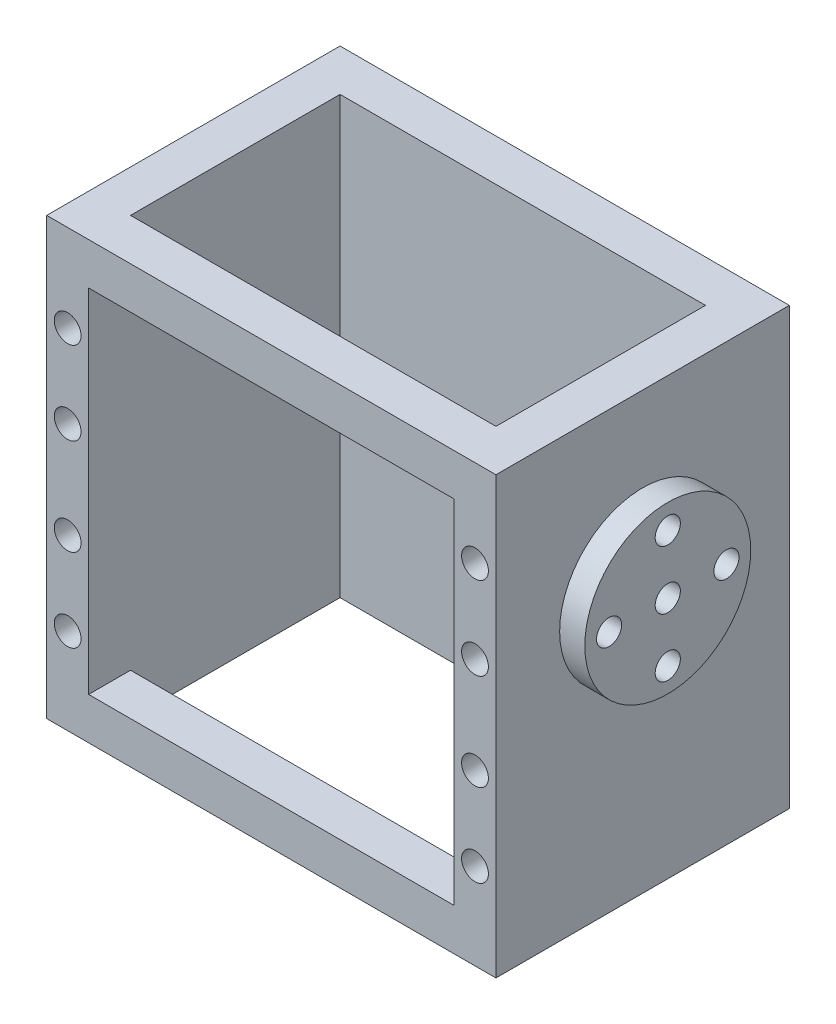
ISO-10303-21;
HEADER;
FILE_DESCRIPTION(('STEP AP214'),'2;1');
FILE_NAME('part.step','',(''),(''),'','','');
FILE_SCHEMA(('AUTOMOTIVE_DESIGN { 1 0 10303 214 1 1 1 1 }'));
ENDSEC;
DATA;
#1=APPLICATION_CONTEXT('core data for automotive mechanical design processes');
#2=APPLICATION_PROTOCOL_DEFINITION('international standard','automotive_design',2000,#1);
#3=PRODUCT_CONTEXT('',#1,'mechanical');
#4=PRODUCT('Part','Part','',(#3));
#5=PRODUCT_RELATED_PRODUCT_CATEGORY('part','',(#4));
#6=PRODUCT_DEFINITION_FORMATION('','',#4);
#7=PRODUCT_DEFINITION_CONTEXT('part definition',#1,'design');
#8=PRODUCT_DEFINITION('design','',#6,#7);
#9=PRODUCT_DEFINITION_SHAPE('','',#8);
#10=(LENGTH_UNIT() NAMED_UNIT(*) SI_UNIT(.MILLI.,.METRE.));
#11=(NAMED_UNIT(*) PLANE_ANGLE_UNIT() SI_UNIT($,.RADIAN.));
#12=(NAMED_UNIT(*) SI_UNIT($,.STERADIAN.) SOLID_ANGLE_UNIT());
#13=UNCERTAINTY_MEASURE_WITH_UNIT(LENGTH_MEASURE(1.E-05),#10,'distance_accuracy_value','');
#14=(GEOMETRIC_REPRESENTATION_CONTEXT(3) GLOBAL_UNCERTAINTY_ASSIGNED_CONTEXT((#13)) GLOBAL_UNIT_ASSIGNED_CONTEXT((#10,
#11,#12)) REPRESENTATION_CONTEXT('',''));
#15=CARTESIAN_POINT('',(0.,0.,0.));
#16=DIRECTION('',(0.,0.,1.));
#17=DIRECTION('',(1.,0.,0.));
#18=AXIS2_PLACEMENT_3D('',#15,#16,#17);
#19=CARTESIAN_POINT('',(5.,52.,30.));
#20=DIRECTION('',(0.,0.,-1.));
#21=DIRECTION('',(-1.,0.,0.));
#22=AXIS2_PLACEMENT_3D('',#19,#20,#21);
#23=PLANE('',#22);
#24=DIRECTION('',(-1.,0.,0.));
#25=VECTOR('',#24,1.);
#26=CARTESIAN_POINT('',(5.,47.,30.));
#27=LINE('',#26,#25);
#28=CARTESIAN_POINT('',(48.6,47.,30.));
#29=VERTEX_POINT('',#28);
#30=CARTESIAN_POINT('',(5.,47.,30.));
#31=VERTEX_POINT('',#30);
#32=EDGE_CURVE('E183',#29,#31,#27,.T.);
#33=ORIENTED_EDGE('',*,*,#32,.T.);
#34=DIRECTION('',(0.,-1.,0.));
#35=VECTOR('',#34,1.);
#36=CARTESIAN_POINT('',(5.,52.,30.));
#37=LINE('',#36,#35);
#38=CARTESIAN_POINT('',(5.,52.,30.));
#39=VERTEX_POINT('',#38);
#40=EDGE_CURVE('E186',#39,#31,#37,.T.);
#41=ORIENTED_EDGE('',*,*,#40,.F.);
#42=DIRECTION('',(1.,0.,0.));
#43=VECTOR('',#42,1.);
#44=CARTESIAN_POINT('',(5.,52.,30.));
#45=LINE('',#44,#43);
#46=CARTESIAN_POINT('',(48.6,52.,30.));
#47=VERTEX_POINT('',#46);
#48=EDGE_CURVE('E180',#39,#47,#45,.T.);
#49=ORIENTED_EDGE('',*,*,#48,.T.);
#50=DIRECTION('',(0.,-1.,0.));
#51=VECTOR('',#50,1.);
#52=CARTESIAN_POINT('',(48.6,52.,30.));
#53=LINE('',#52,#51);
#54=EDGE_CURVE('E182',#47,#29,#53,.T.);
#55=ORIENTED_EDGE('',*,*,#54,.T.);
#56=EDGE_LOOP('',(#33,#41,#49,#55));
#57=FACE_BOUND('',#56,.T.);
#58=ADVANCED_FACE('F43',(#57),#23,.T.);
#59=CARTESIAN_POINT('',(0.,52.,0.));
#60=DIRECTION('',(0.,1.,0.));
#61=DIRECTION('',(0.,0.,1.));
#62=AXIS2_PLACEMENT_3D('',#59,#60,#61);
#63=PLANE('',#62);
#64=DIRECTION('',(0.,0.,1.));
#65=VECTOR('',#64,1.);
#66=CARTESIAN_POINT('',(0.,52.,0.));
#67=LINE('',#66,#65);
#68=CARTESIAN_POINT('',(0.,52.,0.));
#69=VERTEX_POINT('',#68);
#70=CARTESIAN_POINT('',(0.,52.,35.));
#71=VERTEX_POINT('',#70);
#72=EDGE_CURVE('E335',#69,#71,#67,.T.);
#73=ORIENTED_EDGE('',*,*,#72,.T.);
#74=DIRECTION('',(1.,0.,0.));
#75=VECTOR('',#74,1.);
#76=CARTESIAN_POINT('',(0.,52.,35.));
#77=LINE('',#76,#75);
#78=CARTESIAN_POINT('',(53.6,52.,35.));
#79=VERTEX_POINT('',#78);
#80=EDGE_CURVE('E333',#71,#79,#77,.T.);
#81=ORIENTED_EDGE('',*,*,#80,.T.);
#82=DIRECTION('',(0.,0.,-1.));
#83=VECTOR('',#82,1.);
#84=CARTESIAN_POINT('',(53.6,52.,0.));
#85=LINE('',#84,#83);
#86=CARTESIAN_POINT('',(53.6,52.,0.));
#87=VERTEX_POINT('',#86);
#88=EDGE_CURVE('E331',#79,#87,#85,.T.);
#89=ORIENTED_EDGE('',*,*,#88,.T.);
#90=DIRECTION('',(-1.,0.,0.));
#91=VECTOR('',#90,1.);
#92=CARTESIAN_POINT('',(0.,52.,0.));
#93=LINE('',#92,#91);
#94=EDGE_CURVE('E176',#87,#69,#93,.T.);
#95=ORIENTED_EDGE('',*,*,#94,.T.);
#96=EDGE_LOOP('',(#73,#81,#89,#95));
#97=FACE_BOUND('',#96,.T.);
#98=ORIENTED_EDGE('',*,*,#48,.F.);
#99=DIRECTION('',(0.,0.,1.));
#100=VECTOR('',#99,1.);
#101=CARTESIAN_POINT('',(5.,52.,5.));
#102=LINE('',#101,#100);
#103=CARTESIAN_POINT('',(5.,52.,5.));
#104=VERTEX_POINT('',#103);
#105=EDGE_CURVE('E184',#104,#39,#102,.T.);
#106=ORIENTED_EDGE('',*,*,#105,.F.);
#107=DIRECTION('',(-1.,0.,0.));
#108=VECTOR('',#107,1.);
#109=CARTESIAN_POINT('',(5.,52.,5.));
#110=LINE('',#109,#108);
#111=CARTESIAN_POINT('',(48.6,52.,5.));
#112=VERTEX_POINT('',#111);
#113=EDGE_CURVE('E156',#112,#104,#110,.T.);
#114=ORIENTED_EDGE('',*,*,#113,.F.);
#115=DIRECTION('',(0.,0.,-1.));
#116=VECTOR('',#115,1.);
#117=CARTESIAN_POINT('',(48.6,52.,5.));
#118=LINE('',#117,#116);
#119=EDGE_CURVE('E153',#47,#112,#118,.T.);
#120=ORIENTED_EDGE('',*,*,#119,.F.);
#121=EDGE_LOOP('',(#98,#106,#114,#120));
#122=FACE_BOUND('',#121,.T.);
#123=ADVANCED_FACE('F269',(#97,#122),#63,.T.);
#124=CARTESIAN_POINT('',(0.,0.,0.));
#125=DIRECTION('',(0.,1.,0.));
#126=DIRECTION('',(0.,0.,1.));
#127=AXIS2_PLACEMENT_3D('',#124,#125,#126);
#128=PLANE('',#127);
#129=DIRECTION('',(0.,0.,1.));
#130=VECTOR('',#129,1.);
#131=CARTESIAN_POINT('',(0.,0.,0.));
#132=LINE('',#131,#130);
#133=CARTESIAN_POINT('',(0.,0.,0.));
#134=VERTEX_POINT('',#133);
#135=CARTESIAN_POINT('',(0.,0.,35.));
#136=VERTEX_POINT('',#135);
#137=EDGE_CURVE('E166',#134,#136,#132,.T.);
#138=ORIENTED_EDGE('',*,*,#137,.F.);
#139=DIRECTION('',(-1.,0.,0.));
#140=VECTOR('',#139,1.);
#141=CARTESIAN_POINT('',(0.,0.,0.));
#142=LINE('',#141,#140);
#143=CARTESIAN_POINT('',(53.6,0.,0.));
#144=VERTEX_POINT('',#143);
#145=EDGE_CURVE('E318',#144,#134,#142,.T.);
#146=ORIENTED_EDGE('',*,*,#145,.F.);
#147=DIRECTION('',(0.,0.,-1.));
#148=VECTOR('',#147,1.);
#149=CARTESIAN_POINT('',(53.6,0.,0.));
#150=LINE('',#149,#148);
#151=CARTESIAN_POINT('',(53.6,0.,35.));
#152=VERTEX_POINT('',#151);
#153=EDGE_CURVE('E319',#152,#144,#150,.T.);
#154=ORIENTED_EDGE('',*,*,#153,.F.);
#155=DIRECTION('',(1.,0.,0.));
#156=VECTOR('',#155,1.);
#157=CARTESIAN_POINT('',(0.,0.,35.));
#158=LINE('',#157,#156);
#159=EDGE_CURVE('E314',#136,#152,#158,.T.);
#160=ORIENTED_EDGE('',*,*,#159,.F.);
#161=EDGE_LOOP('',(#138,#146,#154,#160));
#162=FACE_BOUND('',#161,.T.);
#163=DIRECTION('',(0.,0.,1.));
#164=VECTOR('',#163,1.);
#165=CARTESIAN_POINT('',(5.,0.,5.));
#166=LINE('',#165,#164);
#167=CARTESIAN_POINT('',(5.,0.,5.));
#168=VERTEX_POINT('',#167);
#169=CARTESIAN_POINT('',(5.,0.,30.));
#170=VERTEX_POINT('',#169);
#171=EDGE_CURVE('E171',#168,#170,#166,.T.);
#172=ORIENTED_EDGE('',*,*,#171,.T.);
#173=DIRECTION('',(1.,0.,0.));
#174=VECTOR('',#173,1.);
#175=CARTESIAN_POINT('',(5.,0.,30.));
#176=LINE('',#175,#174);
#177=CARTESIAN_POINT('',(48.6,0.,30.));
#178=VERTEX_POINT('',#177);
#179=EDGE_CURVE('E169',#170,#178,#176,.T.);
#180=ORIENTED_EDGE('',*,*,#179,.T.);
#181=DIRECTION('',(0.,0.,-1.));
#182=VECTOR('',#181,1.);
#183=CARTESIAN_POINT('',(48.6,0.,5.));
#184=LINE('',#183,#182);
#185=CARTESIAN_POINT('',(48.6,0.,5.));
#186=VERTEX_POINT('',#185);
#187=EDGE_CURVE('E149',#178,#186,#184,.T.);
#188=ORIENTED_EDGE('',*,*,#187,.T.);
#189=DIRECTION('',(-1.,0.,0.));
#190=VECTOR('',#189,1.);
#191=CARTESIAN_POINT('',(5.,0.,5.));
#192=LINE('',#191,#190);
#193=EDGE_CURVE('E160',#186,#168,#192,.T.);
#194=ORIENTED_EDGE('',*,*,#193,.T.);
#195=EDGE_LOOP('',(#172,#180,#188,#194));
#196=FACE_BOUND('',#195,.T.);
#197=ADVANCED_FACE('F168',(#162,#196),#128,.F.);
#198=CARTESIAN_POINT('',(0.,52.,0.));
#199=DIRECTION('',(1.,0.,0.));
#200=DIRECTION('',(0.,0.,-1.));
#201=AXIS2_PLACEMENT_3D('',#198,#199,#200);
#202=PLANE('',#201);
#203=CARTESIAN_POINT('',(0.,32.,17.5));
#204=DIRECTION('',(-1.,0.,0.));
#205=DIRECTION('',(0.,0.,1.));
#206=AXIS2_PLACEMENT_3D('',#203,#204,#205);
#207=CIRCLE('',#206,5.);
#208=CARTESIAN_POINT('',(0.,32.,22.5));
#209=VERTEX_POINT('',#208);
#210=EDGE_CURVE('E12',#209,#209,#207,.T.);
#211=ORIENTED_EDGE('',*,*,#210,.F.);
#212=EDGE_LOOP('',(#211));
#213=FACE_BOUND('',#212,.T.);
#214=ORIENTED_EDGE('',*,*,#137,.T.);
#215=DIRECTION('',(0.,-1.,0.));
#216=VECTOR('',#215,1.);
#217=CARTESIAN_POINT('',(0.,52.,35.));
#218=LINE('',#217,#216);
#219=EDGE_CURVE('E311',#71,#136,#218,.T.);
#220=ORIENTED_EDGE('',*,*,#219,.F.);
#221=ORIENTED_EDGE('',*,*,#72,.F.);
#222=DIRECTION('',(0.,-1.,0.));
#223=VECTOR('',#222,1.);
#224=CARTESIAN_POINT('',(0.,52.,0.));
#225=LINE('',#224,#223);
#226=EDGE_CURVE('E322',#69,#134,#225,.T.);
#227=ORIENTED_EDGE('',*,*,#226,.T.);
#228=EDGE_LOOP('',(#214,#220,#221,#227));
#229=FACE_BOUND('',#228,.T.);
#230=ADVANCED_FACE('F282',(#213,#229),#202,.F.);
#231=CARTESIAN_POINT('',(0.,52.,35.));
#232=DIRECTION('',(0.,0.,-1.));
#233=DIRECTION('',(-1.,0.,0.));
#234=AXIS2_PLACEMENT_3D('',#231,#232,#233);
#235=PLANE('',#234);
#236=CARTESIAN_POINT('',(51.1,20.2,35.));
#237=DIRECTION('',(0.,0.,1.));
#238=DIRECTION('',(1.,0.,0.));
#239=AXIS2_PLACEMENT_3D('',#236,#237,#238);
#240=CIRCLE('',#239,1.6);
#241=CARTESIAN_POINT('',(52.7,20.2,35.));
#242=VERTEX_POINT('',#241);
#243=EDGE_CURVE('E244',#242,#242,#240,.T.);
#244=ORIENTED_EDGE('',*,*,#243,.F.);
#245=EDGE_LOOP('',(#244));
#246=FACE_BOUND('',#245,.T.);
#247=CARTESIAN_POINT('',(51.1,10.3,35.));
#248=DIRECTION('',(0.,0.,1.));
#249=DIRECTION('',(1.,0.,0.));
#250=AXIS2_PLACEMENT_3D('',#247,#248,#249);
#251=CIRCLE('',#250,1.6);
#252=CARTESIAN_POINT('',(52.7,10.3,35.));
#253=VERTEX_POINT('',#252);
#254=EDGE_CURVE('E238',#253,#253,#251,.T.);
#255=ORIENTED_EDGE('',*,*,#254,.F.);
#256=EDGE_LOOP('',(#255));
#257=FACE_BOUND('',#256,.T.);
#258=CARTESIAN_POINT('',(2.5,10.3,35.));
#259=DIRECTION('',(0.,0.,1.));
#260=DIRECTION('',(1.,0.,0.));
#261=AXIS2_PLACEMENT_3D('',#258,#259,#260);
#262=CIRCLE('',#261,1.6);
#263=CARTESIAN_POINT('',(4.1,10.3,35.));
#264=VERTEX_POINT('',#263);
#265=EDGE_CURVE('E232',#264,#264,#262,.T.);
#266=ORIENTED_EDGE('',*,*,#265,.F.);
#267=EDGE_LOOP('',(#266));
#268=FACE_BOUND('',#267,.T.);
#269=CARTESIAN_POINT('',(2.5,20.2,35.));
#270=DIRECTION('',(0.,0.,1.));
#271=DIRECTION('',(1.,0.,0.));
#272=AXIS2_PLACEMENT_3D('',#269,#270,#271);
#273=CIRCLE('',#272,1.6);
#274=CARTESIAN_POINT('',(4.1,20.2,35.));
#275=VERTEX_POINT('',#274);
#276=EDGE_CURVE('E222',#275,#275,#273,.T.);
#277=ORIENTED_EDGE('',*,*,#276,.F.);
#278=EDGE_LOOP('',(#277));
#279=FACE_BOUND('',#278,.T.);
#280=CARTESIAN_POINT('',(2.5,31.7,35.));
#281=DIRECTION('',(0.,0.,1.));
#282=DIRECTION('',(1.,0.,0.));
#283=AXIS2_PLACEMENT_3D('',#280,#281,#282);
#284=CIRCLE('',#283,1.6);
#285=CARTESIAN_POINT('',(4.1,31.7,35.));
#286=VERTEX_POINT('',#285);
#287=EDGE_CURVE('E215',#286,#286,#284,.T.);
#288=ORIENTED_EDGE('',*,*,#287,.F.);
#289=EDGE_LOOP('',(#288));
#290=FACE_BOUND('',#289,.T.);
#291=CARTESIAN_POINT('',(51.1,31.7,35.));
#292=DIRECTION('',(0.,0.,1.));
#293=DIRECTION('',(1.,0.,0.));
#294=AXIS2_PLACEMENT_3D('',#291,#292,#293);
#295=CIRCLE('',#294,1.60000000000001);
#296=CARTESIAN_POINT('',(52.7,31.7,35.));
#297=VERTEX_POINT('',#296);
#298=EDGE_CURVE('E214',#297,#297,#295,.T.);
#299=ORIENTED_EDGE('',*,*,#298,.F.);
#300=EDGE_LOOP('',(#299));
#301=FACE_BOUND('',#300,.T.);
#302=CARTESIAN_POINT('',(51.1,41.6,35.));
#303=DIRECTION('',(0.,0.,1.));
#304=DIRECTION('',(1.,0.,0.));
#305=AXIS2_PLACEMENT_3D('',#302,#303,#304);
#306=CIRCLE('',#305,1.59999999999999);
#307=CARTESIAN_POINT('',(52.7,41.6,35.));
#308=VERTEX_POINT('',#307);
#309=EDGE_CURVE('E207',#308,#308,#306,.T.);
#310=ORIENTED_EDGE('',*,*,#309,.F.);
#311=EDGE_LOOP('',(#310));
#312=FACE_BOUND('',#311,.T.);
#313=CARTESIAN_POINT('',(2.5,41.6,35.));
#314=DIRECTION('',(0.,0.,1.));
#315=DIRECTION('',(1.,0.,0.));
#316=AXIS2_PLACEMENT_3D('',#313,#314,#315);
#317=CIRCLE('',#316,1.59999999999999);
#318=CARTESIAN_POINT('',(4.09999999999999,41.6,35.));
#319=VERTEX_POINT('',#318);
#320=EDGE_CURVE('E201',#319,#319,#317,.T.);
#321=ORIENTED_EDGE('',*,*,#320,.F.);
#322=EDGE_LOOP('',(#321));
#323=FACE_BOUND('',#322,.T.);
#324=DIRECTION('',(1.,0.,0.));
#325=VECTOR('',#324,1.);
#326=CARTESIAN_POINT('',(5.00000000000001,5.,35.));
#327=LINE('',#326,#325);
#328=CARTESIAN_POINT('',(5.00000000000001,5.,35.));
#329=VERTEX_POINT('',#328);
#330=CARTESIAN_POINT('',(48.6,5.,35.));
#331=VERTEX_POINT('',#330);
#332=EDGE_CURVE('E62',#329,#331,#327,.T.);
#333=ORIENTED_EDGE('',*,*,#332,.F.);
#334=DIRECTION('',(0.,-1.,0.));
#335=VECTOR('',#334,1.);
#336=CARTESIAN_POINT('',(5.,47.,35.));
#337=LINE('',#336,#335);
#338=CARTESIAN_POINT('',(5.,47.,35.));
#339=VERTEX_POINT('',#338);
#340=EDGE_CURVE('E111',#339,#329,#337,.T.);
#341=ORIENTED_EDGE('',*,*,#340,.F.);
#342=DIRECTION('',(-1.,0.,0.));
#343=VECTOR('',#342,1.);
#344=CARTESIAN_POINT('',(5.,47.,35.));
#345=LINE('',#344,#343);
#346=CARTESIAN_POINT('',(48.6,47.,35.));
#347=VERTEX_POINT('',#346);
#348=EDGE_CURVE('E195',#347,#339,#345,.T.);
#349=ORIENTED_EDGE('',*,*,#348,.F.);
#350=DIRECTION('',(0.,1.,0.));
#351=VECTOR('',#350,1.);
#352=CARTESIAN_POINT('',(48.6,47.,35.));
#353=LINE('',#352,#351);
#354=EDGE_CURVE('E179',#331,#347,#353,.T.);
#355=ORIENTED_EDGE('',*,*,#354,.F.);
#356=EDGE_LOOP('',(#333,#341,#349,#355));
#357=FACE_BOUND('',#356,.T.);
#358=ORIENTED_EDGE('',*,*,#159,.T.);
#359=DIRECTION('',(0.,-1.,0.));
#360=VECTOR('',#359,1.);
#361=CARTESIAN_POINT('',(53.6,52.,35.));
#362=LINE('',#361,#360);
#363=EDGE_CURVE('E315',#79,#152,#362,.T.);
#364=ORIENTED_EDGE('',*,*,#363,.F.);
#365=ORIENTED_EDGE('',*,*,#80,.F.);
#366=ORIENTED_EDGE('',*,*,#219,.T.);
#367=EDGE_LOOP('',(#358,#364,#365,#366));
#368=FACE_BOUND('',#367,.T.);
#369=ADVANCED_FACE('F290',(#246,#257,#268,#279,#290,#301,#312,#323,#357,#368),#235,.F.);
#370=CARTESIAN_POINT('',(53.6,52.,0.));
#371=DIRECTION('',(-1.,0.,0.));
#372=DIRECTION('',(0.,0.,1.));
#373=AXIS2_PLACEMENT_3D('',#370,#371,#372);
#374=PLANE('',#373);
#375=CARTESIAN_POINT('',(53.6,32.,17.5));
#376=DIRECTION('',(-1.,0.,0.));
#377=DIRECTION('',(0.,0.,1.));
#378=AXIS2_PLACEMENT_3D('',#375,#376,#377);
#379=CIRCLE('',#378,9.9);
#380=CARTESIAN_POINT('',(53.6,32.,27.4));
#381=VERTEX_POINT('',#380);
#382=EDGE_CURVE('E47',#381,#381,#379,.T.);
#383=ORIENTED_EDGE('',*,*,#382,.T.);
#384=EDGE_LOOP('',(#383));
#385=FACE_BOUND('',#384,.T.);
#386=ORIENTED_EDGE('',*,*,#153,.T.);
#387=DIRECTION('',(0.,-1.,0.));
#388=VECTOR('',#387,1.);
#389=CARTESIAN_POINT('',(53.6,52.,0.));
#390=LINE('',#389,#388);
#391=EDGE_CURVE('E187',#87,#144,#390,.T.);
#392=ORIENTED_EDGE('',*,*,#391,.F.);
#393=ORIENTED_EDGE('',*,*,#88,.F.);
#394=ORIENTED_EDGE('',*,*,#363,.T.);
#395=EDGE_LOOP('',(#386,#392,#393,#394));
#396=FACE_BOUND('',#395,.T.);
#397=ADVANCED_FACE('F286',(#385,#396),#374,.F.);
#398=CARTESIAN_POINT('',(0.,52.,0.));
#399=DIRECTION('',(0.,0.,1.));
#400=DIRECTION('',(1.,0.,0.));
#401=AXIS2_PLACEMENT_3D('',#398,#399,#400);
#402=PLANE('',#401);
#403=ORIENTED_EDGE('',*,*,#145,.T.);
#404=ORIENTED_EDGE('',*,*,#226,.F.);
#405=ORIENTED_EDGE('',*,*,#94,.F.);
#406=ORIENTED_EDGE('',*,*,#391,.T.);
#407=EDGE_LOOP('',(#403,#404,#405,#406));
#408=FACE_BOUND('',#407,.T.);
#409=ADVANCED_FACE('F278',(#408),#402,.F.);
#410=CARTESIAN_POINT('',(5.,52.,5.));
#411=DIRECTION('',(1.,0.,0.));
#412=DIRECTION('',(0.,0.,-1.));
#413=AXIS2_PLACEMENT_3D('',#410,#411,#412);
#414=PLANE('',#413);
#415=ORIENTED_EDGE('',*,*,#171,.F.);
#416=DIRECTION('',(0.,-1.,0.));
#417=VECTOR('',#416,1.);
#418=CARTESIAN_POINT('',(5.,52.,5.));
#419=LINE('',#418,#417);
#420=EDGE_CURVE('E163',#104,#168,#419,.T.);
#421=ORIENTED_EDGE('',*,*,#420,.F.);
#422=ORIENTED_EDGE('',*,*,#105,.T.);
#423=ORIENTED_EDGE('',*,*,#40,.T.);
#424=DIRECTION('',(0.,0.,1.));
#425=VECTOR('',#424,1.);
#426=CARTESIAN_POINT('',(5.,47.,30.));
#427=LINE('',#426,#425);
#428=EDGE_CURVE('E107',#31,#339,#427,.T.);
#429=ORIENTED_EDGE('',*,*,#428,.T.);
#430=ORIENTED_EDGE('',*,*,#340,.T.);
#431=DIRECTION('',(0.,0.,1.));
#432=VECTOR('',#431,1.);
#433=CARTESIAN_POINT('',(5.00000000000001,5.,30.));
#434=LINE('',#433,#432);
#435=CARTESIAN_POINT('',(5.00000000000001,5.,30.));
#436=VERTEX_POINT('',#435);
#437=EDGE_CURVE('E188',#436,#329,#434,.T.);
#438=ORIENTED_EDGE('',*,*,#437,.F.);
#439=EDGE_CURVE('E88',#436,#170,#37,.T.);
#440=ORIENTED_EDGE('',*,*,#439,.T.);
#441=EDGE_LOOP('',(#415,#421,#422,#423,#429,#430,#438,#440));
#442=FACE_BOUND('',#441,.T.);
#443=ADVANCED_FACE('F266',(#442),#414,.T.);
#444=DIRECTION('',(1.,0.,0.));
#445=VECTOR('',#444,1.);
#446=CARTESIAN_POINT('',(5.00000000000001,5.,30.));
#447=LINE('',#446,#445);
#448=CARTESIAN_POINT('',(48.6,5.,30.));
#449=VERTEX_POINT('',#448);
#450=EDGE_CURVE('E80',#436,#449,#447,.T.);
#451=ORIENTED_EDGE('',*,*,#450,.T.);
#452=EDGE_CURVE('E193',#449,#178,#53,.T.);
#453=ORIENTED_EDGE('',*,*,#452,.T.);
#454=ORIENTED_EDGE('',*,*,#179,.F.);
#455=ORIENTED_EDGE('',*,*,#439,.F.);
#456=EDGE_LOOP('',(#451,#453,#454,#455));
#457=FACE_BOUND('',#456,.T.);
#458=ADVANCED_FACE('F258',(#457),#23,.T.);
#459=CARTESIAN_POINT('',(48.6,52.,5.));
#460=DIRECTION('',(-1.,0.,0.));
#461=DIRECTION('',(0.,0.,1.));
#462=AXIS2_PLACEMENT_3D('',#459,#460,#461);
#463=PLANE('',#462);
#464=CARTESIAN_POINT('',(48.6,32.,17.5));
#465=DIRECTION('',(-1.,0.,0.));
#466=DIRECTION('',(0.,0.,1.));
#467=AXIS2_PLACEMENT_3D('',#464,#465,#466);
#468=CIRCLE('',#467,9.9);
#469=CARTESIAN_POINT('',(48.6,32.,27.4));
#470=VERTEX_POINT('',#469);
#471=EDGE_CURVE('E53',#470,#470,#468,.T.);
#472=ORIENTED_EDGE('',*,*,#471,.F.);
#473=EDGE_LOOP('',(#472));
#474=FACE_BOUND('',#473,.T.);
#475=ORIENTED_EDGE('',*,*,#187,.F.);
#476=ORIENTED_EDGE('',*,*,#452,.F.);
#477=DIRECTION('',(0.,0.,1.));
#478=VECTOR('',#477,1.);
#479=CARTESIAN_POINT('',(48.6,5.,30.));
#480=LINE('',#479,#478);
#481=EDGE_CURVE('E191',#449,#331,#480,.T.);
#482=ORIENTED_EDGE('',*,*,#481,.T.);
#483=ORIENTED_EDGE('',*,*,#354,.T.);
#484=DIRECTION('',(0.,0.,1.));
#485=VECTOR('',#484,1.);
#486=CARTESIAN_POINT('',(48.6,47.,30.));
#487=LINE('',#486,#485);
#488=EDGE_CURVE('E190',#29,#347,#487,.T.);
#489=ORIENTED_EDGE('',*,*,#488,.F.);
#490=ORIENTED_EDGE('',*,*,#54,.F.);
#491=ORIENTED_EDGE('',*,*,#119,.T.);
#492=DIRECTION('',(0.,-1.,0.));
#493=VECTOR('',#492,1.);
#494=CARTESIAN_POINT('',(48.6,52.,5.));
#495=LINE('',#494,#493);
#496=EDGE_CURVE('E144',#112,#186,#495,.T.);
#497=ORIENTED_EDGE('',*,*,#496,.T.);
#498=EDGE_LOOP('',(#475,#476,#482,#483,#489,#490,#491,#497));
#499=FACE_BOUND('',#498,.T.);
#500=ADVANCED_FACE('F146',(#474,#499),#463,.T.);
#501=CARTESIAN_POINT('',(5.,52.,5.));
#502=DIRECTION('',(0.,0.,1.));
#503=DIRECTION('',(1.,0.,0.));
#504=AXIS2_PLACEMENT_3D('',#501,#502,#503);
#505=PLANE('',#504);
#506=ORIENTED_EDGE('',*,*,#193,.F.);
#507=ORIENTED_EDGE('',*,*,#496,.F.);
#508=ORIENTED_EDGE('',*,*,#113,.T.);
#509=ORIENTED_EDGE('',*,*,#420,.T.);
#510=EDGE_LOOP('',(#506,#507,#508,#509));
#511=FACE_BOUND('',#510,.T.);
#512=ADVANCED_FACE('F161',(#511),#505,.T.);
#513=CARTESIAN_POINT('',(5.,47.,30.));
#514=DIRECTION('',(0.,1.,0.));
#515=DIRECTION('',(0.,0.,1.));
#516=AXIS2_PLACEMENT_3D('',#513,#514,#515);
#517=PLANE('',#516);
#518=ORIENTED_EDGE('',*,*,#348,.T.);
#519=ORIENTED_EDGE('',*,*,#428,.F.);
#520=ORIENTED_EDGE('',*,*,#32,.F.);
#521=ORIENTED_EDGE('',*,*,#488,.T.);
#522=EDGE_LOOP('',(#518,#519,#520,#521));
#523=FACE_BOUND('',#522,.T.);
#524=ADVANCED_FACE('F264',(#523),#517,.F.);
#525=CARTESIAN_POINT('',(5.00000000000001,5.,30.));
#526=DIRECTION('',(0.,-1.,0.));
#527=DIRECTION('',(0.,0.,-1.));
#528=AXIS2_PLACEMENT_3D('',#525,#526,#527);
#529=PLANE('',#528);
#530=ORIENTED_EDGE('',*,*,#481,.F.);
#531=ORIENTED_EDGE('',*,*,#450,.F.);
#532=ORIENTED_EDGE('',*,*,#437,.T.);
#533=ORIENTED_EDGE('',*,*,#332,.T.);
#534=EDGE_LOOP('',(#530,#531,#532,#533));
#535=FACE_BOUND('',#534,.T.);
#536=ADVANCED_FACE('F351',(#535),#529,.F.);
#537=CARTESIAN_POINT('',(2.5,41.6,30.));
#538=DIRECTION('',(0.,0.,1.));
#539=DIRECTION('',(1.,0.,0.));
#540=AXIS2_PLACEMENT_3D('',#537,#538,#539);
#541=CYLINDRICAL_SURFACE('',#540,1.59999999999999);
#542=CARTESIAN_POINT('',(2.5,41.6,30.));
#543=DIRECTION('',(0.,0.,1.));
#544=DIRECTION('',(1.,0.,0.));
#545=AXIS2_PLACEMENT_3D('',#542,#543,#544);
#546=CIRCLE('',#545,1.59999999999999);
#547=CARTESIAN_POINT('',(4.09999999999999,41.6,30.));
#548=VERTEX_POINT('',#547);
#549=EDGE_CURVE('E211',#548,#548,#546,.T.);
#550=ORIENTED_EDGE('',*,*,#549,.F.);
#551=EDGE_LOOP('',(#550));
#552=FACE_BOUND('',#551,.T.);
#553=ORIENTED_EDGE('',*,*,#320,.T.);
#554=EDGE_LOOP('',(#553));
#555=FACE_BOUND('',#554,.T.);
#556=ADVANCED_FACE('F356',(#552,#555),#541,.F.);
#557=CARTESIAN_POINT('',(2.5,41.6,30.));
#558=DIRECTION('',(0.,0.,1.));
#559=DIRECTION('',(1.,0.,0.));
#560=AXIS2_PLACEMENT_3D('',#557,#558,#559);
#561=PLANE('',#560);
#562=ORIENTED_EDGE('',*,*,#549,.T.);
#563=EDGE_LOOP('',(#562));
#564=FACE_BOUND('',#563,.T.);
#565=ADVANCED_FACE('F363',(#564),#561,.T.);
#566=CARTESIAN_POINT('',(51.1,41.6,30.));
#567=DIRECTION('',(0.,0.,1.));
#568=DIRECTION('',(1.,0.,0.));
#569=AXIS2_PLACEMENT_3D('',#566,#567,#568);
#570=CYLINDRICAL_SURFACE('',#569,1.59999999999999);
#571=CARTESIAN_POINT('',(51.1,41.6,30.));
#572=DIRECTION('',(0.,0.,1.));
#573=DIRECTION('',(1.,0.,0.));
#574=AXIS2_PLACEMENT_3D('',#571,#572,#573);
#575=CIRCLE('',#574,1.59999999999999);
#576=CARTESIAN_POINT('',(52.7,41.6,30.));
#577=VERTEX_POINT('',#576);
#578=EDGE_CURVE('E210',#577,#577,#575,.T.);
#579=ORIENTED_EDGE('',*,*,#578,.F.);
#580=EDGE_LOOP('',(#579));
#581=FACE_BOUND('',#580,.T.);
#582=ORIENTED_EDGE('',*,*,#309,.T.);
#583=EDGE_LOOP('',(#582));
#584=FACE_BOUND('',#583,.T.);
#585=ADVANCED_FACE('F359',(#581,#584),#570,.F.);
#586=CARTESIAN_POINT('',(51.1,41.6,30.));
#587=DIRECTION('',(0.,0.,1.));
#588=DIRECTION('',(1.,0.,0.));
#589=AXIS2_PLACEMENT_3D('',#586,#587,#588);
#590=PLANE('',#589);
#591=ORIENTED_EDGE('',*,*,#578,.T.);
#592=EDGE_LOOP('',(#591));
#593=FACE_BOUND('',#592,.T.);
#594=ADVANCED_FACE('F362',(#593),#590,.T.);
#595=CARTESIAN_POINT('',(51.1,31.7,30.));
#596=DIRECTION('',(0.,0.,1.));
#597=DIRECTION('',(1.,0.,0.));
#598=AXIS2_PLACEMENT_3D('',#595,#596,#597);
#599=CYLINDRICAL_SURFACE('',#598,1.60000000000001);
#600=CARTESIAN_POINT('',(51.1,31.7,30.));
#601=DIRECTION('',(0.,0.,1.));
#602=DIRECTION('',(1.,0.,0.));
#603=AXIS2_PLACEMENT_3D('',#600,#601,#602);
#604=CIRCLE('',#603,1.60000000000001);
#605=CARTESIAN_POINT('',(52.7,31.7,30.));
#606=VERTEX_POINT('',#605);
#607=EDGE_CURVE('E219',#606,#606,#604,.T.);
#608=ORIENTED_EDGE('',*,*,#607,.F.);
#609=EDGE_LOOP('',(#608));
#610=FACE_BOUND('',#609,.T.);
#611=ORIENTED_EDGE('',*,*,#298,.T.);
#612=EDGE_LOOP('',(#611));
#613=FACE_BOUND('',#612,.T.);
#614=ADVANCED_FACE('F367',(#610,#613),#599,.F.);
#615=CARTESIAN_POINT('',(51.1,31.7,30.));
#616=DIRECTION('',(0.,0.,1.));
#617=DIRECTION('',(1.,0.,0.));
#618=AXIS2_PLACEMENT_3D('',#615,#616,#617);
#619=PLANE('',#618);
#620=ORIENTED_EDGE('',*,*,#607,.T.);
#621=EDGE_LOOP('',(#620));
#622=FACE_BOUND('',#621,.T.);
#623=ADVANCED_FACE('F373',(#622),#619,.T.);
#624=CARTESIAN_POINT('',(2.5,31.7,30.));
#625=DIRECTION('',(0.,0.,1.));
#626=DIRECTION('',(1.,0.,0.));
#627=AXIS2_PLACEMENT_3D('',#624,#625,#626);
#628=CYLINDRICAL_SURFACE('',#627,1.6);
#629=CARTESIAN_POINT('',(2.5,31.7,30.));
#630=DIRECTION('',(0.,0.,1.));
#631=DIRECTION('',(1.,0.,0.));
#632=AXIS2_PLACEMENT_3D('',#629,#630,#631);
#633=CIRCLE('',#632,1.6);
#634=CARTESIAN_POINT('',(4.1,31.7,30.));
#635=VERTEX_POINT('',#634);
#636=EDGE_CURVE('E218',#635,#635,#633,.T.);
#637=ORIENTED_EDGE('',*,*,#636,.F.);
#638=EDGE_LOOP('',(#637));
#639=FACE_BOUND('',#638,.T.);
#640=ORIENTED_EDGE('',*,*,#287,.T.);
#641=EDGE_LOOP('',(#640));
#642=FACE_BOUND('',#641,.T.);
#643=ADVANCED_FACE('F369',(#639,#642),#628,.F.);
#644=CARTESIAN_POINT('',(2.5,31.7,30.));
#645=DIRECTION('',(0.,0.,1.));
#646=DIRECTION('',(1.,0.,0.));
#647=AXIS2_PLACEMENT_3D('',#644,#645,#646);
#648=PLANE('',#647);
#649=ORIENTED_EDGE('',*,*,#636,.T.);
#650=EDGE_LOOP('',(#649));
#651=FACE_BOUND('',#650,.T.);
#652=ADVANCED_FACE('F372',(#651),#648,.T.);
#653=CARTESIAN_POINT('',(2.5,20.2,30.));
#654=DIRECTION('',(0.,0.,1.));
#655=DIRECTION('',(1.,0.,0.));
#656=AXIS2_PLACEMENT_3D('',#653,#654,#655);
#657=CYLINDRICAL_SURFACE('',#656,1.6);
#658=CARTESIAN_POINT('',(2.5,20.2,30.));
#659=DIRECTION('',(0.,0.,1.));
#660=DIRECTION('',(1.,0.,0.));
#661=AXIS2_PLACEMENT_3D('',#658,#659,#660);
#662=CIRCLE('',#661,1.6);
#663=CARTESIAN_POINT('',(4.1,20.2,30.));
#664=VERTEX_POINT('',#663);
#665=EDGE_CURVE('E229',#664,#664,#662,.T.);
#666=ORIENTED_EDGE('',*,*,#665,.F.);
#667=EDGE_LOOP('',(#666));
#668=FACE_BOUND('',#667,.T.);
#669=ORIENTED_EDGE('',*,*,#276,.T.);
#670=EDGE_LOOP('',(#669));
#671=FACE_BOUND('',#670,.T.);
#672=ADVANCED_FACE('F377',(#668,#671),#657,.F.);
#673=CARTESIAN_POINT('',(2.5,20.2,30.));
#674=DIRECTION('',(0.,0.,1.));
#675=DIRECTION('',(1.,0.,0.));
#676=AXIS2_PLACEMENT_3D('',#673,#674,#675);
#677=PLANE('',#676);
#678=ORIENTED_EDGE('',*,*,#665,.T.);
#679=EDGE_LOOP('',(#678));
#680=FACE_BOUND('',#679,.T.);
#681=ADVANCED_FACE('F387',(#680),#677,.T.);
#682=CARTESIAN_POINT('',(2.5,10.3,30.));
#683=DIRECTION('',(0.,0.,1.));
#684=DIRECTION('',(1.,0.,0.));
#685=AXIS2_PLACEMENT_3D('',#682,#683,#684);
#686=CYLINDRICAL_SURFACE('',#685,1.6);
#687=CARTESIAN_POINT('',(2.5,10.3,30.));
#688=DIRECTION('',(0.,0.,1.));
#689=DIRECTION('',(1.,0.,0.));
#690=AXIS2_PLACEMENT_3D('',#687,#688,#689);
#691=CIRCLE('',#690,1.6);
#692=CARTESIAN_POINT('',(4.1,10.3,30.));
#693=VERTEX_POINT('',#692);
#694=EDGE_CURVE('E235',#693,#693,#691,.T.);
#695=ORIENTED_EDGE('',*,*,#694,.F.);
#696=EDGE_LOOP('',(#695));
#697=FACE_BOUND('',#696,.T.);
#698=ORIENTED_EDGE('',*,*,#265,.T.);
#699=EDGE_LOOP('',(#698));
#700=FACE_BOUND('',#699,.T.);
#701=ADVANCED_FACE('F391',(#697,#700),#686,.F.);
#702=CARTESIAN_POINT('',(2.5,10.3,30.));
#703=DIRECTION('',(0.,0.,1.));
#704=DIRECTION('',(1.,0.,0.));
#705=AXIS2_PLACEMENT_3D('',#702,#703,#704);
#706=PLANE('',#705);
#707=ORIENTED_EDGE('',*,*,#694,.T.);
#708=EDGE_LOOP('',(#707));
#709=FACE_BOUND('',#708,.T.);
#710=ADVANCED_FACE('F395',(#709),#706,.T.);
#711=CARTESIAN_POINT('',(51.1,10.3,30.));
#712=DIRECTION('',(0.,0.,1.));
#713=DIRECTION('',(1.,0.,0.));
#714=AXIS2_PLACEMENT_3D('',#711,#712,#713);
#715=CYLINDRICAL_SURFACE('',#714,1.6);
#716=CARTESIAN_POINT('',(51.1,10.3,30.));
#717=DIRECTION('',(0.,0.,1.));
#718=DIRECTION('',(1.,0.,0.));
#719=AXIS2_PLACEMENT_3D('',#716,#717,#718);
#720=CIRCLE('',#719,1.6);
#721=CARTESIAN_POINT('',(52.7,10.3,30.));
#722=VERTEX_POINT('',#721);
#723=EDGE_CURVE('E241',#722,#722,#720,.T.);
#724=ORIENTED_EDGE('',*,*,#723,.F.);
#725=EDGE_LOOP('',(#724));
#726=FACE_BOUND('',#725,.T.);
#727=ORIENTED_EDGE('',*,*,#254,.T.);
#728=EDGE_LOOP('',(#727));
#729=FACE_BOUND('',#728,.T.);
#730=ADVANCED_FACE('F399',(#726,#729),#715,.F.);
#731=CARTESIAN_POINT('',(51.1,10.3,30.));
#732=DIRECTION('',(0.,0.,1.));
#733=DIRECTION('',(1.,0.,0.));
#734=AXIS2_PLACEMENT_3D('',#731,#732,#733);
#735=PLANE('',#734);
#736=ORIENTED_EDGE('',*,*,#723,.T.);
#737=EDGE_LOOP('',(#736));
#738=FACE_BOUND('',#737,.T.);
#739=ADVANCED_FACE('F403',(#738),#735,.T.);
#740=CARTESIAN_POINT('',(51.1,20.2,30.));
#741=DIRECTION('',(0.,0.,1.));
#742=DIRECTION('',(1.,0.,0.));
#743=AXIS2_PLACEMENT_3D('',#740,#741,#742);
#744=CYLINDRICAL_SURFACE('',#743,1.6);
#745=CARTESIAN_POINT('',(51.1,20.2,30.));
#746=DIRECTION('',(0.,0.,1.));
#747=DIRECTION('',(1.,0.,0.));
#748=AXIS2_PLACEMENT_3D('',#745,#746,#747);
#749=CIRCLE('',#748,1.6);
#750=CARTESIAN_POINT('',(52.7,20.2,30.));
#751=VERTEX_POINT('',#750);
#752=EDGE_CURVE('E247',#751,#751,#749,.T.);
#753=ORIENTED_EDGE('',*,*,#752,.F.);
#754=EDGE_LOOP('',(#753));
#755=FACE_BOUND('',#754,.T.);
#756=ORIENTED_EDGE('',*,*,#243,.T.);
#757=EDGE_LOOP('',(#756));
#758=FACE_BOUND('',#757,.T.);
#759=ADVANCED_FACE('F407',(#755,#758),#744,.F.);
#760=CARTESIAN_POINT('',(51.1,20.2,30.));
#761=DIRECTION('',(0.,0.,1.));
#762=DIRECTION('',(1.,0.,0.));
#763=AXIS2_PLACEMENT_3D('',#760,#761,#762);
#764=PLANE('',#763);
#765=ORIENTED_EDGE('',*,*,#752,.T.);
#766=EDGE_LOOP('',(#765));
#767=FACE_BOUND('',#766,.T.);
#768=ADVANCED_FACE('F411',(#767),#764,.T.);
#769=CARTESIAN_POINT('',(53.6,32.,17.5));
#770=DIRECTION('',(-1.,0.,0.));
#771=DIRECTION('',(0.,0.,1.));
#772=AXIS2_PLACEMENT_3D('',#769,#770,#771);
#773=CYLINDRICAL_SURFACE('',#772,9.9);
#774=ORIENTED_EDGE('',*,*,#382,.F.);
#775=EDGE_LOOP('',(#774));
#776=FACE_BOUND('',#775,.T.);
#777=ORIENTED_EDGE('',*,*,#471,.T.);
#778=EDGE_LOOP('',(#777));
#779=FACE_BOUND('',#778,.T.);
#780=ADVANCED_FACE('F45',(#776,#779),#773,.F.);
#781=CARTESIAN_POINT('',(-5.,32.,17.5));
#782=DIRECTION('',(1.,0.,0.));
#783=DIRECTION('',(0.,0.,-1.));
#784=AXIS2_PLACEMENT_3D('',#781,#782,#783);
#785=CYLINDRICAL_SURFACE('',#784,5.);
#786=CARTESIAN_POINT('',(-5.,32.,17.5));
#787=DIRECTION('',(-1.,0.,0.));
#788=DIRECTION('',(0.,0.,1.));
#789=AXIS2_PLACEMENT_3D('',#786,#787,#788);
#790=CIRCLE('',#789,5.);
#791=CARTESIAN_POINT('',(-5.,32.,22.5));
#792=VERTEX_POINT('',#791);
#793=EDGE_CURVE('E205',#792,#792,#790,.T.);
#794=ORIENTED_EDGE('',*,*,#793,.F.);
#795=EDGE_LOOP('',(#794));
#796=FACE_BOUND('',#795,.T.);
#797=ORIENTED_EDGE('',*,*,#210,.T.);
#798=EDGE_LOOP('',(#797));
#799=FACE_BOUND('',#798,.T.);
#800=ADVANCED_FACE('F298',(#796,#799),#785,.T.);
#801=CARTESIAN_POINT('',(-5.,32.,17.5));
#802=DIRECTION('',(-1.,0.,0.));
#803=DIRECTION('',(0.,0.,1.));
#804=AXIS2_PLACEMENT_3D('',#801,#802,#803);
#805=PLANE('',#804);
#806=ORIENTED_EDGE('',*,*,#793,.T.);
#807=EDGE_LOOP('',(#806));
#808=FACE_BOUND('',#807,.T.);
#809=ADVANCED_FACE('F301',(#808),#805,.T.);
#810=CLOSED_SHELL('',(#58,#123,#197,#230,#369,#397,#409,#443,#458,#500,#512,#524,#536,#556,#565,
#585,#594,#614,#623,#643,#652,#672,#681,#701,#710,#730,#739,#759,#768,#780,#800,#809));
#811=MANIFOLD_SOLID_BREP('B2',#810);
#812=CARTESIAN_POINT('',(56.6,32.,17.5));
#813=DIRECTION('',(-1.,0.,0.));
#814=DIRECTION('',(0.,0.,1.));
#815=AXIS2_PLACEMENT_3D('',#812,#813,#814);
#816=CYLINDRICAL_SURFACE('',#815,1.5);
#817=CARTESIAN_POINT('',(56.6,32.,17.5));
#818=DIRECTION('',(1.,0.,0.));
#819=DIRECTION('',(0.,0.,-1.));
#820=AXIS2_PLACEMENT_3D('',#817,#818,#819);
#821=CIRCLE('',#820,1.5);
#822=CARTESIAN_POINT('',(56.6,32.,16.));
#823=VERTEX_POINT('',#822);
#824=EDGE_CURVE('E698',#823,#823,#821,.T.);
#825=ORIENTED_EDGE('',*,*,#824,.T.);
#826=EDGE_LOOP('',(#825));
#827=FACE_BOUND('',#826,.T.);
#828=CARTESIAN_POINT('',(53.6,32.,17.5));
#829=DIRECTION('',(1.,0.,0.));
#830=DIRECTION('',(0.,0.,-1.));
#831=AXIS2_PLACEMENT_3D('',#828,#829,#830);
#832=CIRCLE('',#831,1.5);
#833=CARTESIAN_POINT('',(53.6,32.,16.));
#834=VERTEX_POINT('',#833);
#835=EDGE_CURVE('E684',#834,#834,#832,.T.);
#836=ORIENTED_EDGE('',*,*,#835,.F.);
#837=EDGE_LOOP('',(#836));
#838=FACE_BOUND('',#837,.T.);
#839=ADVANCED_FACE('F662',(#827,#838),#816,.F.);
#840=CARTESIAN_POINT('',(56.6,25.,17.5));
#841=DIRECTION('',(-1.,0.,0.));
#842=DIRECTION('',(0.,0.,1.));
#843=AXIS2_PLACEMENT_3D('',#840,#841,#842);
#844=CYLINDRICAL_SURFACE('',#843,1.5);
#845=CARTESIAN_POINT('',(56.6,25.,17.5));
#846=DIRECTION('',(1.,0.,0.));
#847=DIRECTION('',(0.,0.,-1.));
#848=AXIS2_PLACEMENT_3D('',#845,#846,#847);
#849=CIRCLE('',#848,1.5);
#850=CARTESIAN_POINT('',(56.6,25.,16.));
#851=VERTEX_POINT('',#850);
#852=EDGE_CURVE('E678',#851,#851,#849,.T.);
#853=ORIENTED_EDGE('',*,*,#852,.T.);
#854=EDGE_LOOP('',(#853));
#855=FACE_BOUND('',#854,.T.);
#856=CARTESIAN_POINT('',(53.6,25.,17.5));
#857=DIRECTION('',(1.,0.,0.));
#858=DIRECTION('',(0.,0.,-1.));
#859=AXIS2_PLACEMENT_3D('',#856,#857,#858);
#860=CIRCLE('',#859,1.5);
#861=CARTESIAN_POINT('',(53.6,25.,16.));
#862=VERTEX_POINT('',#861);
#863=EDGE_CURVE('E688',#862,#862,#860,.T.);
#864=ORIENTED_EDGE('',*,*,#863,.F.);
#865=EDGE_LOOP('',(#864));
#866=FACE_BOUND('',#865,.T.);
#867=ADVANCED_FACE('F713',(#855,#866),#844,.F.);
#868=CARTESIAN_POINT('',(56.6,39.,17.5));
#869=DIRECTION('',(-1.,0.,0.));
#870=DIRECTION('',(0.,0.,1.));
#871=AXIS2_PLACEMENT_3D('',#868,#869,#870);
#872=CYLINDRICAL_SURFACE('',#871,1.5);
#873=CARTESIAN_POINT('',(56.6,39.,17.5));
#874=DIRECTION('',(1.,0.,0.));
#875=DIRECTION('',(0.,0.,-1.));
#876=AXIS2_PLACEMENT_3D('',#873,#874,#875);
#877=CIRCLE('',#876,1.5);
#878=CARTESIAN_POINT('',(56.6,39.,16.));
#879=VERTEX_POINT('',#878);
#880=EDGE_CURVE('E669',#879,#879,#877,.T.);
#881=ORIENTED_EDGE('',*,*,#880,.T.);
#882=EDGE_LOOP('',(#881));
#883=FACE_BOUND('',#882,.T.);
#884=CARTESIAN_POINT('',(53.6,39.,17.5));
#885=DIRECTION('',(1.,0.,0.));
#886=DIRECTION('',(0.,0.,-1.));
#887=AXIS2_PLACEMENT_3D('',#884,#885,#886);
#888=CIRCLE('',#887,1.5);
#889=CARTESIAN_POINT('',(53.6,39.,16.));
#890=VERTEX_POINT('',#889);
#891=EDGE_CURVE('E682',#890,#890,#888,.T.);
#892=ORIENTED_EDGE('',*,*,#891,.F.);
#893=EDGE_LOOP('',(#892));
#894=FACE_BOUND('',#893,.T.);
#895=ADVANCED_FACE('F715',(#883,#894),#872,.F.);
#896=CARTESIAN_POINT('',(56.6,32.,10.5));
#897=DIRECTION('',(-1.,0.,0.));
#898=DIRECTION('',(0.,0.,1.));
#899=AXIS2_PLACEMENT_3D('',#896,#897,#898);
#900=CYLINDRICAL_SURFACE('',#899,1.5);
#901=CARTESIAN_POINT('',(56.6,32.,10.5));
#902=DIRECTION('',(1.,0.,0.));
#903=DIRECTION('',(0.,0.,-1.));
#904=AXIS2_PLACEMENT_3D('',#901,#902,#903);
#905=CIRCLE('',#904,1.5);
#906=CARTESIAN_POINT('',(56.6,32.,8.99999999999999));
#907=VERTEX_POINT('',#906);
#908=EDGE_CURVE('E673',#907,#907,#905,.T.);
#909=ORIENTED_EDGE('',*,*,#908,.T.);
#910=EDGE_LOOP('',(#909));
#911=FACE_BOUND('',#910,.T.);
#912=CARTESIAN_POINT('',(53.6,32.,10.5));
#913=DIRECTION('',(1.,0.,0.));
#914=DIRECTION('',(0.,0.,-1.));
#915=AXIS2_PLACEMENT_3D('',#912,#913,#914);
#916=CIRCLE('',#915,1.5);
#917=CARTESIAN_POINT('',(53.6,32.,9.));
#918=VERTEX_POINT('',#917);
#919=EDGE_CURVE('E681',#918,#918,#916,.T.);
#920=ORIENTED_EDGE('',*,*,#919,.F.);
#921=EDGE_LOOP('',(#920));
#922=FACE_BOUND('',#921,.T.);
#923=ADVANCED_FACE('F722',(#911,#922),#900,.F.);
#924=CARTESIAN_POINT('',(56.6,32.,24.5));
#925=DIRECTION('',(-1.,0.,0.));
#926=DIRECTION('',(0.,0.,1.));
#927=AXIS2_PLACEMENT_3D('',#924,#925,#926);
#928=CYLINDRICAL_SURFACE('',#927,1.5);
#929=CARTESIAN_POINT('',(56.6,32.,24.5));
#930=DIRECTION('',(1.,0.,0.));
#931=DIRECTION('',(0.,0.,-1.));
#932=AXIS2_PLACEMENT_3D('',#929,#930,#931);
#933=CIRCLE('',#932,1.5);
#934=CARTESIAN_POINT('',(56.6,32.,23.));
#935=VERTEX_POINT('',#934);
#936=EDGE_CURVE('E699',#935,#935,#933,.T.);
#937=ORIENTED_EDGE('',*,*,#936,.T.);
#938=EDGE_LOOP('',(#937));
#939=FACE_BOUND('',#938,.T.);
#940=CARTESIAN_POINT('',(53.6,32.,24.5));
#941=DIRECTION('',(1.,0.,0.));
#942=DIRECTION('',(0.,0.,-1.));
#943=AXIS2_PLACEMENT_3D('',#940,#941,#942);
#944=CIRCLE('',#943,1.5);
#945=CARTESIAN_POINT('',(53.6,32.,23.));
#946=VERTEX_POINT('',#945);
#947=EDGE_CURVE('E702',#946,#946,#944,.T.);
#948=ORIENTED_EDGE('',*,*,#947,.F.);
#949=EDGE_LOOP('',(#948));
#950=FACE_BOUND('',#949,.T.);
#951=ADVANCED_FACE('F728',(#939,#950),#928,.F.);
#952=CARTESIAN_POINT('',(56.6,32.,17.5));
#953=DIRECTION('',(1.,0.,0.));
#954=DIRECTION('',(0.,0.,-1.));
#955=AXIS2_PLACEMENT_3D('',#952,#953,#954);
#956=PLANE('',#955);
#957=ORIENTED_EDGE('',*,*,#936,.F.);
#958=EDGE_LOOP('',(#957));
#959=FACE_BOUND('',#958,.T.);
#960=ORIENTED_EDGE('',*,*,#908,.F.);
#961=EDGE_LOOP('',(#960));
#962=FACE_BOUND('',#961,.T.);
#963=CARTESIAN_POINT('',(56.6,32.,17.5));
#964=DIRECTION('',(1.,0.,0.));
#965=DIRECTION('',(0.,0.,-1.));
#966=AXIS2_PLACEMENT_3D('',#963,#964,#965);
#967=CIRCLE('',#966,9.9);
#968=CARTESIAN_POINT('',(56.6,32.,7.6));
#969=VERTEX_POINT('',#968);
#970=EDGE_CURVE('E42',#969,#969,#967,.T.);
#971=ORIENTED_EDGE('',*,*,#970,.T.);
#972=EDGE_LOOP('',(#971));
#973=FACE_BOUND('',#972,.T.);
#974=ORIENTED_EDGE('',*,*,#880,.F.);
#975=EDGE_LOOP('',(#974));
#976=FACE_BOUND('',#975,.T.);
#977=ORIENTED_EDGE('',*,*,#852,.F.);
#978=EDGE_LOOP('',(#977));
#979=FACE_BOUND('',#978,.T.);
#980=ORIENTED_EDGE('',*,*,#824,.F.);
#981=EDGE_LOOP('',(#980));
#982=FACE_BOUND('',#981,.T.);
#983=ADVANCED_FACE('F731',(#959,#962,#973,#976,#979,#982),#956,.T.);
#984=CARTESIAN_POINT('',(56.6,32.,17.5));
#985=DIRECTION('',(-1.,0.,0.));
#986=DIRECTION('',(0.,0.,1.));
#987=AXIS2_PLACEMENT_3D('',#984,#985,#986);
#988=CYLINDRICAL_SURFACE('',#987,9.9);
#989=ORIENTED_EDGE('',*,*,#970,.F.);
#990=EDGE_LOOP('',(#989));
#991=FACE_BOUND('',#990,.T.);
#992=CARTESIAN_POINT('',(53.6,32.,17.5));
#993=DIRECTION('',(-1.,0.,0.));
#994=DIRECTION('',(0.,0.,1.));
#995=AXIS2_PLACEMENT_3D('',#992,#993,#994);
#996=CIRCLE('',#995,9.9);
#997=CARTESIAN_POINT('',(53.6,32.,27.4));
#998=VERTEX_POINT('',#997);
#999=EDGE_CURVE('E690',#998,#998,#996,.T.);
#1000=ORIENTED_EDGE('',*,*,#999,.F.);
#1001=EDGE_LOOP('',(#1000));
#1002=FACE_BOUND('',#1001,.T.);
#1003=ADVANCED_FACE('F664',(#991,#1002),#988,.T.);
#1004=CARTESIAN_POINT('',(53.6,32.,17.5));
#1005=DIRECTION('',(-1.,0.,0.));
#1006=DIRECTION('',(0.,0.,1.));
#1007=AXIS2_PLACEMENT_3D('',#1004,#1005,#1006);
#1008=PLANE('',#1007);
#1009=ORIENTED_EDGE('',*,*,#999,.T.);
#1010=EDGE_LOOP('',(#1009));
#1011=FACE_BOUND('',#1010,.T.);
#1012=ORIENTED_EDGE('',*,*,#835,.T.);
#1013=EDGE_LOOP('',(#1012));
#1014=FACE_BOUND('',#1013,.T.);
#1015=ORIENTED_EDGE('',*,*,#891,.T.);
#1016=EDGE_LOOP('',(#1015));
#1017=FACE_BOUND('',#1016,.T.);
#1018=ORIENTED_EDGE('',*,*,#919,.T.);
#1019=EDGE_LOOP('',(#1018));
#1020=FACE_BOUND('',#1019,.T.);
#1021=ORIENTED_EDGE('',*,*,#863,.T.);
#1022=EDGE_LOOP('',(#1021));
#1023=FACE_BOUND('',#1022,.T.);
#1024=ORIENTED_EDGE('',*,*,#947,.T.);
#1025=EDGE_LOOP('',(#1024));
#1026=FACE_BOUND('',#1025,.T.);
#1027=ADVANCED_FACE('F710',(#1011,#1014,#1017,#1020,#1023,#1026),#1008,.T.);
#1028=CLOSED_SHELL('',(#839,#867,#895,#923,#951,#983,#1003,#1027));
#1029=MANIFOLD_SOLID_BREP('B6',#1028);
#1030=ADVANCED_BREP_SHAPE_REPRESENTATION('',(#18,#811,#1029),#14);
#1031=SHAPE_DEFINITION_REPRESENTATION(#9,#1030);
ENDSEC;
END-ISO-10303-21;
